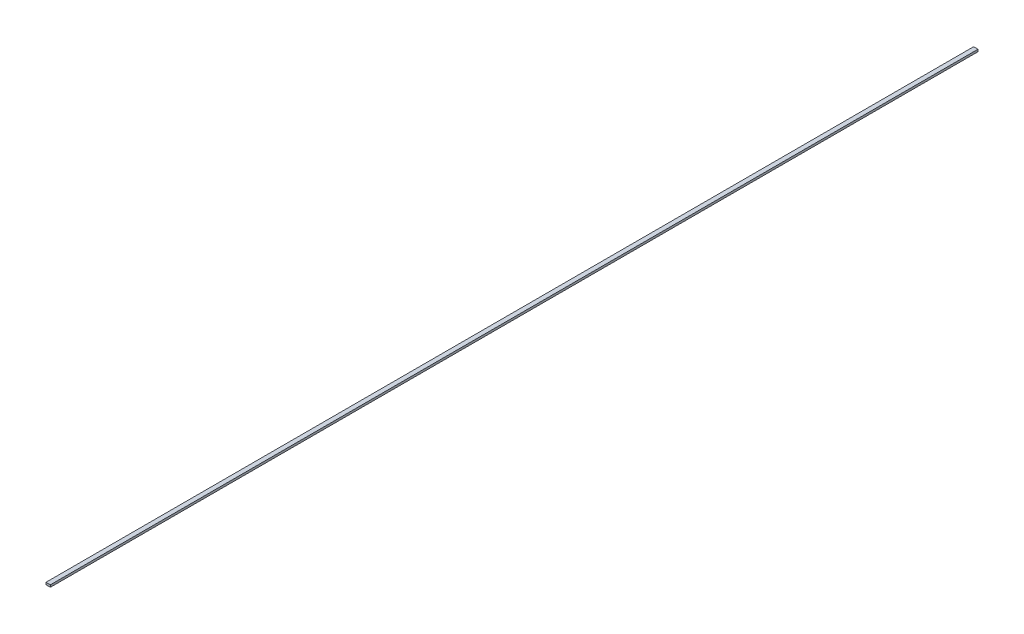
ISO-10303-21;
HEADER;
FILE_DESCRIPTION(('STEP AP214'),'2;1');
FILE_NAME('part.step','',(''),(''),'','','');
FILE_SCHEMA(('AUTOMOTIVE_DESIGN { 1 0 10303 214 1 1 1 1 }'));
ENDSEC;
DATA;
#1=APPLICATION_CONTEXT('core data for automotive mechanical design processes');
#2=APPLICATION_PROTOCOL_DEFINITION('international standard','automotive_design',2000,#1);
#3=PRODUCT_CONTEXT('',#1,'mechanical');
#4=PRODUCT('Part','Part','',(#3));
#5=PRODUCT_RELATED_PRODUCT_CATEGORY('part','',(#4));
#6=PRODUCT_DEFINITION_FORMATION('','',#4);
#7=PRODUCT_DEFINITION_CONTEXT('part definition',#1,'design');
#8=PRODUCT_DEFINITION('design','',#6,#7);
#9=PRODUCT_DEFINITION_SHAPE('','',#8);
#10=(LENGTH_UNIT() NAMED_UNIT(*) SI_UNIT(.MILLI.,.METRE.));
#11=(NAMED_UNIT(*) PLANE_ANGLE_UNIT() SI_UNIT($,.RADIAN.));
#12=(NAMED_UNIT(*) SI_UNIT($,.STERADIAN.) SOLID_ANGLE_UNIT());
#13=UNCERTAINTY_MEASURE_WITH_UNIT(LENGTH_MEASURE(1.E-05),#10,'distance_accuracy_value','');
#14=(GEOMETRIC_REPRESENTATION_CONTEXT(3) GLOBAL_UNCERTAINTY_ASSIGNED_CONTEXT((#13)) GLOBAL_UNIT_ASSIGNED_CONTEXT((#10,
#11,#12)) REPRESENTATION_CONTEXT('',''));
#15=CARTESIAN_POINT('',(0.,0.,0.));
#16=DIRECTION('',(0.,0.,1.));
#17=DIRECTION('',(1.,0.,0.));
#18=AXIS2_PLACEMENT_3D('',#15,#16,#17);
#19=CARTESIAN_POINT('',(0.,0.,1060.));
#20=DIRECTION('',(1.,0.,0.));
#21=DIRECTION('',(0.,0.,-1.));
#22=AXIS2_PLACEMENT_3D('',#19,#20,#21);
#23=PLANE('',#22);
#24=DIRECTION('',(0.,-1.,0.));
#25=VECTOR('',#24,1.);
#26=CARTESIAN_POINT('',(0.,0.,0.));
#27=LINE('',#26,#25);
#28=CARTESIAN_POINT('',(0.,2.5,0.));
#29=VERTEX_POINT('',#28);
#30=CARTESIAN_POINT('',(0.,0.,0.));
#31=VERTEX_POINT('',#30);
#32=EDGE_CURVE('E107',#29,#31,#27,.T.);
#33=ORIENTED_EDGE('',*,*,#32,.T.);
#34=DIRECTION('',(0.,0.,-1.));
#35=VECTOR('',#34,1.);
#36=CARTESIAN_POINT('',(0.,0.,1060.));
#37=LINE('',#36,#35);
#38=CARTESIAN_POINT('',(0.,0.,1060.));
#39=VERTEX_POINT('',#38);
#40=EDGE_CURVE('E11',#39,#31,#37,.T.);
#41=ORIENTED_EDGE('',*,*,#40,.F.);
#42=DIRECTION('',(0.,-1.,0.));
#43=VECTOR('',#42,1.);
#44=CARTESIAN_POINT('',(0.,0.,1060.));
#45=LINE('',#44,#43);
#46=CARTESIAN_POINT('',(0.,2.5,1060.));
#47=VERTEX_POINT('',#46);
#48=EDGE_CURVE('E91',#47,#39,#45,.T.);
#49=ORIENTED_EDGE('',*,*,#48,.F.);
#50=DIRECTION('',(0.,0.,-1.));
#51=VECTOR('',#50,1.);
#52=CARTESIAN_POINT('',(0.,2.5,1060.));
#53=LINE('',#52,#51);
#54=EDGE_CURVE('E103',#47,#29,#53,.T.);
#55=ORIENTED_EDGE('',*,*,#54,.T.);
#56=EDGE_LOOP('',(#33,#41,#49,#55));
#57=FACE_BOUND('',#56,.T.);
#58=ADVANCED_FACE('F39',(#57),#23,.F.);
#59=CARTESIAN_POINT('',(0.,0.,1060.));
#60=DIRECTION('',(0.,1.,0.));
#61=DIRECTION('',(0.,0.,1.));
#62=AXIS2_PLACEMENT_3D('',#59,#60,#61);
#63=PLANE('',#62);
#64=DIRECTION('',(1.,0.,0.));
#65=VECTOR('',#64,1.);
#66=CARTESIAN_POINT('',(0.,0.,0.));
#67=LINE('',#66,#65);
#68=CARTESIAN_POINT('',(5.,0.,0.));
#69=VERTEX_POINT('',#68);
#70=EDGE_CURVE('E96',#31,#69,#67,.T.);
#71=ORIENTED_EDGE('',*,*,#70,.T.);
#72=DIRECTION('',(0.,0.,-1.));
#73=VECTOR('',#72,1.);
#74=CARTESIAN_POINT('',(5.,0.,1060.));
#75=LINE('',#74,#73);
#76=CARTESIAN_POINT('',(5.,0.,1060.));
#77=VERTEX_POINT('',#76);
#78=EDGE_CURVE('E48',#77,#69,#75,.T.);
#79=ORIENTED_EDGE('',*,*,#78,.F.);
#80=DIRECTION('',(1.,0.,0.));
#81=VECTOR('',#80,1.);
#82=CARTESIAN_POINT('',(0.,0.,1060.));
#83=LINE('',#82,#81);
#84=EDGE_CURVE('E86',#39,#77,#83,.T.);
#85=ORIENTED_EDGE('',*,*,#84,.F.);
#86=ORIENTED_EDGE('',*,*,#40,.T.);
#87=EDGE_LOOP('',(#71,#79,#85,#86));
#88=FACE_BOUND('',#87,.T.);
#89=ADVANCED_FACE('F95',(#88),#63,.F.);
#90=CARTESIAN_POINT('',(5.,0.,1060.));
#91=DIRECTION('',(-1.,0.,0.));
#92=DIRECTION('',(0.,0.,1.));
#93=AXIS2_PLACEMENT_3D('',#90,#91,#92);
#94=PLANE('',#93);
#95=DIRECTION('',(0.,1.,0.));
#96=VECTOR('',#95,1.);
#97=CARTESIAN_POINT('',(5.,0.,0.));
#98=LINE('',#97,#96);
#99=CARTESIAN_POINT('',(5.,2.5,0.));
#100=VERTEX_POINT('',#99);
#101=EDGE_CURVE('E73',#69,#100,#98,.T.);
#102=ORIENTED_EDGE('',*,*,#101,.T.);
#103=DIRECTION('',(0.,0.,-1.));
#104=VECTOR('',#103,1.);
#105=CARTESIAN_POINT('',(5.,2.5,1060.));
#106=LINE('',#105,#104);
#107=CARTESIAN_POINT('',(5.,2.5,1060.));
#108=VERTEX_POINT('',#107);
#109=EDGE_CURVE('E98',#108,#100,#106,.T.);
#110=ORIENTED_EDGE('',*,*,#109,.F.);
#111=DIRECTION('',(0.,1.,0.));
#112=VECTOR('',#111,1.);
#113=CARTESIAN_POINT('',(5.,0.,1060.));
#114=LINE('',#113,#112);
#115=EDGE_CURVE('E89',#77,#108,#114,.T.);
#116=ORIENTED_EDGE('',*,*,#115,.F.);
#117=ORIENTED_EDGE('',*,*,#78,.T.);
#118=EDGE_LOOP('',(#102,#110,#116,#117));
#119=FACE_BOUND('',#118,.T.);
#120=ADVANCED_FACE('F99',(#119),#94,.F.);
#121=CARTESIAN_POINT('',(0.,2.5,1060.));
#122=DIRECTION('',(0.,-1.,0.));
#123=DIRECTION('',(0.,0.,-1.));
#124=AXIS2_PLACEMENT_3D('',#121,#122,#123);
#125=PLANE('',#124);
#126=DIRECTION('',(-1.,0.,0.));
#127=VECTOR('',#126,1.);
#128=CARTESIAN_POINT('',(0.,2.5,0.));
#129=LINE('',#128,#127);
#130=EDGE_CURVE('E79',#100,#29,#129,.T.);
#131=ORIENTED_EDGE('',*,*,#130,.T.);
#132=ORIENTED_EDGE('',*,*,#54,.F.);
#133=DIRECTION('',(-1.,0.,0.));
#134=VECTOR('',#133,1.);
#135=CARTESIAN_POINT('',(0.,2.5,1060.));
#136=LINE('',#135,#134);
#137=EDGE_CURVE('E56',#108,#47,#136,.T.);
#138=ORIENTED_EDGE('',*,*,#137,.F.);
#139=ORIENTED_EDGE('',*,*,#109,.T.);
#140=EDGE_LOOP('',(#131,#132,#138,#139));
#141=FACE_BOUND('',#140,.T.);
#142=ADVANCED_FACE('F120',(#141),#125,.F.);
#143=CARTESIAN_POINT('',(0.,0.,1060.));
#144=DIRECTION('',(0.,0.,-1.));
#145=DIRECTION('',(-1.,0.,0.));
#146=AXIS2_PLACEMENT_3D('',#143,#144,#145);
#147=PLANE('',#146);
#148=ORIENTED_EDGE('',*,*,#48,.T.);
#149=ORIENTED_EDGE('',*,*,#84,.T.);
#150=ORIENTED_EDGE('',*,*,#115,.T.);
#151=ORIENTED_EDGE('',*,*,#137,.T.);
#152=EDGE_LOOP('',(#148,#149,#150,#151));
#153=FACE_BOUND('',#152,.T.);
#154=ADVANCED_FACE('F87',(#153),#147,.F.);
#155=CARTESIAN_POINT('',(0.,0.,0.));
#156=DIRECTION('',(0.,0.,-1.));
#157=DIRECTION('',(-1.,0.,0.));
#158=AXIS2_PLACEMENT_3D('',#155,#156,#157);
#159=PLANE('',#158);
#160=ORIENTED_EDGE('',*,*,#32,.F.);
#161=ORIENTED_EDGE('',*,*,#130,.F.);
#162=ORIENTED_EDGE('',*,*,#101,.F.);
#163=ORIENTED_EDGE('',*,*,#70,.F.);
#164=EDGE_LOOP('',(#160,#161,#162,#163));
#165=FACE_BOUND('',#164,.T.);
#166=ADVANCED_FACE('F123',(#165),#159,.T.);
#167=CLOSED_SHELL('',(#58,#89,#120,#142,#154,#166));
#168=MANIFOLD_SOLID_BREP('B2',#167);
#169=ADVANCED_BREP_SHAPE_REPRESENTATION('',(#18,#168),#14);
#170=SHAPE_DEFINITION_REPRESENTATION(#9,#169);
ENDSEC;
END-ISO-10303-21;
